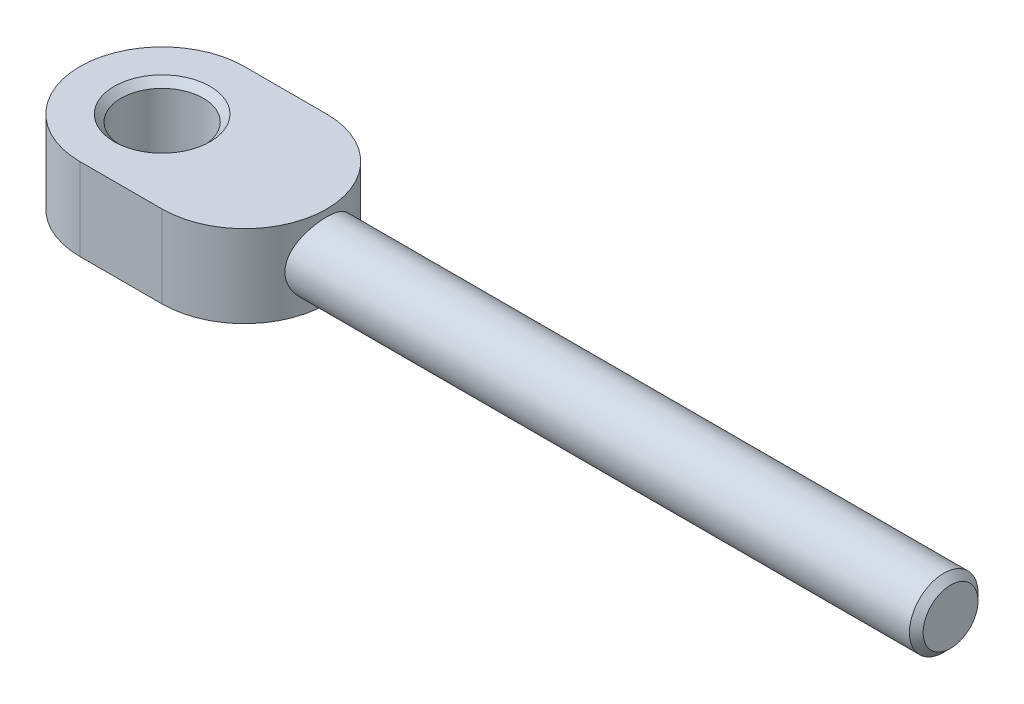
ISO-10303-21;
HEADER;
FILE_DESCRIPTION(('STEP AP214'),'2;1');
FILE_NAME('part.step','',(''),(''),'','','');
FILE_SCHEMA(('AUTOMOTIVE_DESIGN { 1 0 10303 214 1 1 1 1 }'));
ENDSEC;
DATA;
#1=APPLICATION_CONTEXT('core data for automotive mechanical design processes');
#2=APPLICATION_PROTOCOL_DEFINITION('international standard','automotive_design',2000,#1);
#3=PRODUCT_CONTEXT('',#1,'mechanical');
#4=PRODUCT('Part','Part','',(#3));
#5=PRODUCT_RELATED_PRODUCT_CATEGORY('part','',(#4));
#6=PRODUCT_DEFINITION_FORMATION('','',#4);
#7=PRODUCT_DEFINITION_CONTEXT('part definition',#1,'design');
#8=PRODUCT_DEFINITION('design','',#6,#7);
#9=PRODUCT_DEFINITION_SHAPE('','',#8);
#10=(LENGTH_UNIT() NAMED_UNIT(*) SI_UNIT(.MILLI.,.METRE.));
#11=(NAMED_UNIT(*) PLANE_ANGLE_UNIT() SI_UNIT($,.RADIAN.));
#12=(NAMED_UNIT(*) SI_UNIT($,.STERADIAN.) SOLID_ANGLE_UNIT());
#13=UNCERTAINTY_MEASURE_WITH_UNIT(LENGTH_MEASURE(1.E-05),#10,'distance_accuracy_value','');
#14=(GEOMETRIC_REPRESENTATION_CONTEXT(3) GLOBAL_UNCERTAINTY_ASSIGNED_CONTEXT((#13)) GLOBAL_UNIT_ASSIGNED_CONTEXT((#10,
#11,#12)) REPRESENTATION_CONTEXT('',''));
#15=CARTESIAN_POINT('',(0.,0.,0.));
#16=DIRECTION('',(0.,0.,1.));
#17=DIRECTION('',(1.,0.,0.));
#18=AXIS2_PLACEMENT_3D('',#15,#16,#17);
#19=CARTESIAN_POINT('',(115.000000000002,0.,-1.94289029309402E-13));
#20=DIRECTION('',(-1.00000000000002,0.,0.));
#21=DIRECTION('',(0.,0.,1.00000000000002));
#22=AXIS2_PLACEMENT_3D('',#19,#20,#21);
#23=CYLINDRICAL_SURFACE('',#22,5.);
#24=CARTESIAN_POINT('',(114.000000000002,0.,0.));
#25=DIRECTION('',(1.00000000000002,0.,0.));
#26=DIRECTION('',(0.,0.,-1.00000000000002));
#27=AXIS2_PLACEMENT_3D('',#24,#25,#26);
#28=CIRCLE('',#27,5.);
#29=CARTESIAN_POINT('',(114.000000000002,0.,-5.00000000000018));
#30=VERTEX_POINT('',#29);
#31=EDGE_CURVE('E11',#30,#30,#28,.F.);
#32=ORIENTED_EDGE('',*,*,#31,.T.);
#33=EDGE_LOOP('',(#32));
#34=FACE_BOUND('',#33,.T.);
#35=CARTESIAN_POINT('',(22.9087121146363,0.,4.99999999999988));
#36=CARTESIAN_POINT('',(22.9087130764541,0.133401342085642,4.99999907346949));
#37=CARTESIAN_POINT('',(22.9111675954635,0.266850090561973,4.99465346647838));
#38=CARTESIAN_POINT('',(22.9209052166454,0.532776879388233,4.97332510133892));
#39=CARTESIAN_POINT('',(22.9281914710264,0.665254228916836,4.95733539899088));
#40=CARTESIAN_POINT('',(22.9473646401102,0.928469473456003,4.91485001389278));
#41=CARTESIAN_POINT('',(22.9592613290628,1.05920305840854,4.88833200790232));
#42=CARTESIAN_POINT('',(22.9872633476554,1.31775831896715,4.82506361967674));
#43=CARTESIAN_POINT('',(23.0033704480098,1.44557874477889,4.78830893191542));
#44=CARTESIAN_POINT('',(23.0391992954804,1.69685363135249,4.70511611777522));
#45=CARTESIAN_POINT('',(23.0589043317805,1.82032525200758,4.65872262741848));
#46=CARTESIAN_POINT('',(23.1013893730746,2.06279425452701,4.55655723353386));
#47=CARTESIAN_POINT('',(23.1241705351678,2.18178993110429,4.50078179899437));
#48=CARTESIAN_POINT('',(23.1961478055548,2.53089882887935,4.32007909456542));
#49=CARTESIAN_POINT('',(23.2490254866256,2.7534507742884,4.1816696363317));
#50=CARTESIAN_POINT('',(23.3622340846154,3.18533767693499,3.863889601319));
#51=CARTESIAN_POINT('',(23.4228172047291,3.39321817234933,3.68264836841169));
#52=CARTESIAN_POINT('',(23.5425773354487,3.77681295725674,3.28805127368649));
#53=CARTESIAN_POINT('',(23.6017537962911,3.95251484459765,3.07468308711377));
#54=CARTESIAN_POINT('',(23.686117262969,4.19180337790088,2.72939811902856));
#55=CARTESIAN_POINT('',(23.714037011658,4.26885250368095,2.60726265021141));
#56=CARTESIAN_POINT('',(23.7670757792016,4.41231434720151,2.35633907958839));
#57=CARTESIAN_POINT('',(23.7921959593648,4.47873148029959,2.22755376893486));
#58=CARTESIAN_POINT('',(23.8389174407783,4.60033898521952,1.96416180919299));
#59=CARTESIAN_POINT('',(23.8605184059308,4.65552828486767,1.8295546056445));
#60=CARTESIAN_POINT('',(23.8995529267486,4.75409390371573,1.55556138641057));
#61=CARTESIAN_POINT('',(23.9169885604691,4.79747611490186,1.41617779348768));
#62=CARTESIAN_POINT('',(23.9463943774631,4.87004934123769,1.14097065626731));
#63=CARTESIAN_POINT('',(23.9586002649646,4.89985740691071,1.00533485679229));
#64=CARTESIAN_POINT('',(23.9784509152341,4.94810782465678,0.731783678022388));
#65=CARTESIAN_POINT('',(23.9860977087491,4.96655523720069,0.593869341826926));
#66=CARTESIAN_POINT('',(23.9966178230297,4.99189063921309,0.316820356986148));
#67=CARTESIAN_POINT('',(23.9994918028327,4.99878022460505,0.177685879487406));
#68=CARTESIAN_POINT('',(24.0003846753358,5.00092331936389,-0.100685666016704));
#69=CARTESIAN_POINT('',(23.9984037561418,4.99617727955981,-0.239922729838341));
#70=CARTESIAN_POINT('',(23.9899136606257,4.97575198143481,-0.508875497772758));
#71=CARTESIAN_POINT('',(23.9836886839465,4.96075876952393,-0.638652954685859));
#72=CARTESIAN_POINT('',(23.9671679484584,4.92071548412853,-0.896425733019643));
#73=CARTESIAN_POINT('',(23.9568708432385,4.89566208429525,-1.02442045048921));
#74=CARTESIAN_POINT('',(23.9324642419978,4.83574741321434,-1.27768058963465));
#75=CARTESIAN_POINT('',(23.9183560059373,4.80088938322167,-1.40294689855884));
#76=CARTESIAN_POINT('',(23.886674063129,4.72168676926434,-1.65000960949573));
#77=CARTESIAN_POINT('',(23.8690990384667,4.67733857702805,-1.77180467168411));
#78=CARTESIAN_POINT('',(23.8112061935106,4.52913174309925,-2.13440608091085));
#79=CARTESIAN_POINT('',(23.7660875760499,4.41097651707845,-2.36878813427721));
#80=CARTESIAN_POINT('',(23.6674248672801,4.14060259955268,-2.81488765750755));
#81=CARTESIAN_POINT('',(23.6138778002998,3.98837186961975,-3.0265970782525));
#82=CARTESIAN_POINT('',(23.4992708053812,3.64168484169971,-3.43734663974053));
#83=CARTESIAN_POINT('',(23.4379473626344,3.44500850419366,-3.63444183536825));
#84=CARTESIAN_POINT('',(23.3175068359432,3.02111055104933,-3.99374958281568));
#85=CARTESIAN_POINT('',(23.258390610643,2.79387720319629,-4.15594867394895));
#86=CARTESIAN_POINT('',(23.1754830102257,2.43023152890221,-4.37204843185939));
#87=CARTESIAN_POINT('',(23.148419949873,2.30295809039894,-4.44042007897777));
#88=CARTESIAN_POINT('',(23.0975376088837,2.04245647274751,-4.56609824374478));
#89=CARTESIAN_POINT('',(23.0737170007445,1.90923076039166,-4.62340929378724));
#90=CARTESIAN_POINT('',(23.0301558587158,1.63776732088177,-4.72639308965483));
#91=CARTESIAN_POINT('',(23.0104138355821,1.49953144487482,-4.77207008493308));
#92=CARTESIAN_POINT('',(22.9757324560175,1.21903964210898,-4.8513062064981));
#93=CARTESIAN_POINT('',(22.9607926721109,1.07678407439368,-4.88486641140469));
#94=CARTESIAN_POINT('',(22.937096979211,0.798757682076293,-4.93768074905161));
#95=CARTESIAN_POINT('',(22.9280027904064,0.663164820818757,-4.95772169190317));
#96=CARTESIAN_POINT('',(22.9148523191374,0.390552087598846,-4.98660737935067));
#97=CARTESIAN_POINT('',(22.9107956985945,0.253532312021159,-4.99545287528993));
#98=CARTESIAN_POINT('',(22.907869953007,-0.0207860598845476,-5.00183821697967));
#99=CARTESIAN_POINT('',(22.9089993303949,-0.158084564277709,-4.99938132653476));
#100=CARTESIAN_POINT('',(22.916399811976,-0.431871128286718,-4.98320111894265));
#101=CARTESIAN_POINT('',(22.922670762536,-0.568359211995655,-4.96947813843261));
#102=CARTESIAN_POINT('',(22.9395645956426,-0.830715742539823,-4.93217158492255));
#103=CARTESIAN_POINT('',(22.9498816230822,-0.956702590714348,-4.90927900797947));
#104=CARTESIAN_POINT('',(22.9744912995809,-1.20619548163048,-4.85401305684643));
#105=CARTESIAN_POINT('',(22.9887852266844,-1.32970071315868,-4.82163663468438));
#106=CARTESIAN_POINT('',(23.0370194337988,-1.69526799217255,-4.71071065616091));
#107=CARTESIAN_POINT('',(23.0763259662738,-1.93258045461715,-4.61833566351875));
#108=CARTESIAN_POINT('',(23.1668340116271,-2.39850178122618,-4.39509042810533));
#109=CARTESIAN_POINT('',(23.2184687772576,-2.6263164312283,-4.26275559713343));
#110=CARTESIAN_POINT('',(23.3271978594733,-3.05761567004123,-3.96481487774657));
#111=CARTESIAN_POINT('',(23.3842945333692,-3.26108966760645,-3.79919458936839));
#112=CARTESIAN_POINT('',(23.5031524298608,-3.65522822272604,-3.42333828888242));
#113=CARTESIAN_POINT('',(23.5649149877292,-3.84350149729717,-3.21056780271652));
#114=CARTESIAN_POINT('',(23.6525397242181,-4.09731296268247,-2.86918502481998));
#115=CARTESIAN_POINT('',(23.6809270167356,-4.17718980577939,-2.7516088248505));
#116=CARTESIAN_POINT('',(23.7352796462335,-4.32685243773145,-2.50969002115865));
#117=CARTESIAN_POINT('',(23.7612460253416,-4.39664257578391,-2.38535036573329));
#118=CARTESIAN_POINT('',(23.8101156015745,-4.52574998386247,-2.13027929692931));
#119=CARTESIAN_POINT('',(23.8330091330541,-4.58503438709471,-1.99952940315105));
#120=CARTESIAN_POINT('',(23.8749794540164,-4.69228865586859,-1.73293321082224));
#121=CARTESIAN_POINT('',(23.8940578848997,-4.74026338885414,-1.59708913398488));
#122=CARTESIAN_POINT('',(23.9278439649914,-4.82441160370132,-1.32129951277004));
#123=CARTESIAN_POINT('',(23.9425527871689,-4.86058825287263,-1.18135508018583));
#124=CARTESIAN_POINT('',(23.9671605398291,-4.92074045946561,-0.898454675987474));
#125=CARTESIAN_POINT('',(23.9770598307877,-4.9447169313007,-0.755498930910328));
#126=CARTESIAN_POINT('',(23.9912289923399,-4.97893515809701,-0.477883420739305));
#127=CARTESIAN_POINT('',(23.9958449399561,-4.99002214033322,-0.343344870081224));
#128=CARTESIAN_POINT('',(24.0005316025812,-5.00127843426219,-0.0736837007937017));
#129=CARTESIAN_POINT('',(24.000600790194,-5.00144407714272,0.061439098858615));
#130=CARTESIAN_POINT('',(23.9961887486256,-4.99084836103987,0.331106229534478));
#131=CARTESIAN_POINT('',(23.9917099776236,-4.98009290492887,0.465650833621884));
#132=CARTESIAN_POINT('',(23.9783256851577,-4.94777744445908,0.733261310715827));
#133=CARTESIAN_POINT('',(23.9694185152724,-4.92621341670747,0.866326614198201));
#134=CARTESIAN_POINT('',(23.9478093264381,-4.87346965622626,1.12521434278955));
#135=CARTESIAN_POINT('',(23.9352551439936,-4.84266322581637,1.25112522777286));
#136=CARTESIAN_POINT('',(23.9065633482736,-4.77150907395191,1.49981842973083));
#137=CARTESIAN_POINT('',(23.8904244841413,-4.73115802162892,1.62259963790773));
#138=CARTESIAN_POINT('',(23.8371898373545,-4.59630010949805,1.98503132832685));
#139=CARTESIAN_POINT('',(23.7952573948452,-4.48794487316257,2.21898154506235));
#140=CARTESIAN_POINT('',(23.7002297237166,-4.2320286177314,2.67613896894372));
#141=CARTESIAN_POINT('',(23.6467156543535,-4.08291706095642,2.89838282801017));
#142=CARTESIAN_POINT('',(23.5348651891758,-3.75198500696703,3.31565850042848));
#143=CARTESIAN_POINT('',(23.476527007517,-3.57015236713051,3.51068016389769));
#144=CARTESIAN_POINT('',(23.3565857314863,-3.16417617105097,3.8818248709547));
#145=CARTESIAN_POINT('',(23.2950305954801,-2.93799545156913,4.05575892113986));
#146=CARTESIAN_POINT('',(23.2086213285896,-2.57814226412518,4.28644220599592));
#147=CARTESIAN_POINT('',(23.1807840573517,-2.45464555962548,4.35834922317815));
#148=CARTESIAN_POINT('',(23.1279493027588,-2.20148847551084,4.49153302890012));
#149=CARTESIAN_POINT('',(23.1029505274215,-2.07183093851672,4.55281466048565));
#150=CARTESIAN_POINT('',(23.0567342904302,-1.80781229372493,4.66392927630343));
#151=CARTESIAN_POINT('',(23.0354990935147,-1.67347702103789,4.71381629567));
#152=CARTESIAN_POINT('',(22.9974167298329,-1.4005073130341,4.80199267289366));
#153=CARTESIAN_POINT('',(22.9805674126512,-1.26187502201883,4.84028771585223));
#154=CARTESIAN_POINT('',(22.9519122752479,-0.981708136079763,4.90477948429197));
#155=CARTESIAN_POINT('',(22.9400931451405,-0.840182252039889,4.9310081525188));
#156=CARTESIAN_POINT('',(22.9219030893159,-0.555123946379709,4.97116941842814));
#157=CARTESIAN_POINT('',(22.9155279262965,-0.411593173868511,4.98511157956281));
#158=CARTESIAN_POINT('',(22.910902848785,-0.223148156125496,4.99521783051908));
#159=CARTESIAN_POINT('',(22.9100818615665,-0.178543241685151,4.99701063605617));
#160=CARTESIAN_POINT('',(22.9089863310184,-0.0892939886391438,4.99940188134434));
#161=CARTESIAN_POINT('',(22.9087117927143,-0.0446496496746846,5.00000031011113));
#162=CARTESIAN_POINT('',(22.9087121146363,0.,4.99999999999988));
#163=B_SPLINE_CURVE_WITH_KNOTS('',3,(#35,#36,#37,#38,#39,#40,#41,#42,#43,#44,#45,#46,#47,#48,
#49,#50,#51,#52,#53,#54,#55,#56,#57,#58,#59,#60,#61,#62,#63,#64,#65,#66,#67,#68,#69,#70,#71,#72,
#73,#74,#75,#76,#77,#78,#79,#80,#81,#82,#83,#84,#85,#86,#87,#88,#89,#90,#91,#92,#93,#94,#95,#96,
#97,#98,#99,#100,#101,#102,#103,#104,#105,#106,#107,#108,#109,#110,#111,#112,#113,#114,#115,
#116,#117,#118,#119,#120,#121,#122,#123,#124,#125,#126,#127,#128,#129,#130,#131,#132,#133,#134,
#135,#136,#137,#138,#139,#140,#141,#142,#143,#144,#145,#146,#147,#148,#149,#150,#151,#152,#153,
#154,#155,#156,#157,#158,#159,#160,#161,#162),.UNSPECIFIED.,.T.,.F.,(4,2,2,2,2,2,2,2,2,2,2,2,2,
2,2,2,2,2,2,2,2,2,2,2,2,2,2,2,2,2,2,2,2,2,2,2,2,2,2,2,2,2,2,2,2,2,2,2,2,2,2,2,2,2,2,2,2,2,2,2,2,
2,2,4),(0.,0.400157436000185,0.800576190593221,1.201848529411,1.60328989804516,2.0029121038093,
2.4026850502781,3.20123019587007,4.04483609889584,4.88876646006611,5.32954710296573,
5.77014421661478,6.21078338424769,6.65120225878058,7.06888225409976,7.48637606389433,
7.90381222072142,8.32123220399826,8.71313663078891,9.10517074557808,9.49707541213128,
9.88912935105435,10.6843842085816,11.4799204638783,12.3315328967584,13.1834732406337,
13.6239634696044,14.064272810136,14.5044210919574,14.9445301827247,15.3560893757574,
15.7676209469674,16.1790336871391,16.5904341345126,16.9753736617613,17.3604370390525,
18.129966872946,18.9320860691316,19.7345530282235,20.6023475058254,21.0367677320599,
21.4710000820442,21.9065678086379,22.3419477324183,22.7772106778489,23.2124409951532,
23.6171514188592,24.0219977964935,24.4266254703976,24.8314038752674,25.2216396203095,
25.6120117507035,26.3921129345309,27.2074696624054,28.0231295912001,28.8942922255874,
29.3306260081946,29.7667603842385,30.2007814897644,30.6345893903395,31.067242188193,
31.4995579237517,31.6334900472164,31.7674234024045),.UNSPECIFIED.);
#164=CARTESIAN_POINT('',(22.9087121146363,0.,4.99999999999988));
#165=VERTEX_POINT('',#164);
#166=EDGE_CURVE('E132',#165,#165,#163,.T.);
#167=ORIENTED_EDGE('',*,*,#166,.F.);
#168=EDGE_LOOP('',(#167));
#169=FACE_BOUND('',#168,.T.);
#170=ADVANCED_FACE('F41',(#34,#169),#23,.T.);
#171=CARTESIAN_POINT('',(115.000000000002,0.,-1.94289029309402E-13));
#172=DIRECTION('',(1.00000000000002,0.,0.));
#173=DIRECTION('',(0.,0.,-1.00000000000002));
#174=AXIS2_PLACEMENT_3D('',#171,#172,#173);
#175=PLANE('',#174);
#176=CARTESIAN_POINT('',(115.000000000002,0.,-1.94289029309402E-13));
#177=DIRECTION('',(1.00000000000002,0.,0.));
#178=DIRECTION('',(0.,0.,-1.00000000000002));
#179=AXIS2_PLACEMENT_3D('',#176,#177,#178);
#180=CIRCLE('',#179,3.99999999999999);
#181=CARTESIAN_POINT('',(115.000000000002,0.,-4.00000000000026));
#182=VERTEX_POINT('',#181);
#183=EDGE_CURVE('E52',#182,#182,#180,.T.);
#184=ORIENTED_EDGE('',*,*,#183,.T.);
#185=EDGE_LOOP('',(#184));
#186=FACE_BOUND('',#185,.T.);
#187=ADVANCED_FACE('F151',(#186),#175,.T.);
#188=CARTESIAN_POINT('',(12.0000000000002,6.00000000000001,-1.59594559789866E-13));
#189=DIRECTION('',(0.,-1.,0.));
#190=DIRECTION('',(0.,0.,-1.00000000000002));
#191=AXIS2_PLACEMENT_3D('',#188,#189,#190);
#192=CYLINDRICAL_SURFACE('',#191,12.);
#193=CARTESIAN_POINT('',(12.0000000000005,-6.00000000000001,-1.2490009027033E-13));
#194=DIRECTION('',(0.,1.,0.));
#195=DIRECTION('',(0.,0.,1.00000000000002));
#196=AXIS2_PLACEMENT_3D('',#193,#194,#195);
#197=CIRCLE('',#196,12.);
#198=CARTESIAN_POINT('',(12.0000000000002,-6.00000000000001,12.));
#199=VERTEX_POINT('',#198);
#200=CARTESIAN_POINT('',(12.0000000000005,-6.00000000000001,-12.0000000000003));
#201=VERTEX_POINT('',#200);
#202=EDGE_CURVE('E77',#199,#201,#197,.T.);
#203=ORIENTED_EDGE('',*,*,#202,.T.);
#204=DIRECTION('',(0.,-1.,0.));
#205=VECTOR('',#204,1.);
#206=CARTESIAN_POINT('',(12.0000000000003,6.00000000000001,-12.0000000000005));
#207=LINE('',#206,#205);
#208=CARTESIAN_POINT('',(12.0000000000003,6.00000000000001,-12.0000000000005));
#209=VERTEX_POINT('',#208);
#210=EDGE_CURVE('E105',#209,#201,#207,.T.);
#211=ORIENTED_EDGE('',*,*,#210,.F.);
#212=CARTESIAN_POINT('',(12.0000000000002,6.00000000000001,-1.59594559789866E-13));
#213=DIRECTION('',(0.,1.,0.));
#214=DIRECTION('',(0.,0.,1.00000000000002));
#215=AXIS2_PLACEMENT_3D('',#212,#213,#214);
#216=CIRCLE('',#215,12.);
#217=CARTESIAN_POINT('',(12.0000000000001,6.00000000000001,12.));
#218=VERTEX_POINT('',#217);
#219=EDGE_CURVE('E94',#218,#209,#216,.T.);
#220=ORIENTED_EDGE('',*,*,#219,.F.);
#221=DIRECTION('',(0.,-1.,0.));
#222=VECTOR('',#221,1.);
#223=CARTESIAN_POINT('',(12.0000000000001,6.00000000000001,12.));
#224=LINE('',#223,#222);
#225=EDGE_CURVE('E100',#218,#199,#224,.T.);
#226=ORIENTED_EDGE('',*,*,#225,.T.);
#227=EDGE_LOOP('',(#203,#211,#220,#226));
#228=FACE_BOUND('',#227,.T.);
#229=ORIENTED_EDGE('',*,*,#166,.T.);
#230=EDGE_LOOP('',(#229));
#231=FACE_BOUND('',#230,.T.);
#232=ADVANCED_FACE('F107',(#228,#231),#192,.T.);
#233=CARTESIAN_POINT('',(0.,6.00000000000001,0.));
#234=DIRECTION('',(0.,-1.,0.));
#235=DIRECTION('',(0.,0.,-1.00000000000002));
#236=AXIS2_PLACEMENT_3D('',#233,#234,#235);
#237=CYLINDRICAL_SURFACE('',#236,12.);
#238=CARTESIAN_POINT('',(0.,-6.00000000000001,0.));
#239=DIRECTION('',(0.,1.,0.));
#240=DIRECTION('',(0.,0.,1.00000000000002));
#241=AXIS2_PLACEMENT_3D('',#238,#239,#240);
#242=CIRCLE('',#241,12.);
#243=CARTESIAN_POINT('',(0.,-6.00000000000001,-12.0000000000001));
#244=VERTEX_POINT('',#243);
#245=CARTESIAN_POINT('',(0.,-6.00000000000001,12.));
#246=VERTEX_POINT('',#245);
#247=EDGE_CURVE('E116',#244,#246,#242,.T.);
#248=ORIENTED_EDGE('',*,*,#247,.T.);
#249=DIRECTION('',(0.,-1.,0.));
#250=VECTOR('',#249,1.);
#251=CARTESIAN_POINT('',(0.,6.00000000000001,12.));
#252=LINE('',#251,#250);
#253=CARTESIAN_POINT('',(0.,6.00000000000001,12.));
#254=VERTEX_POINT('',#253);
#255=EDGE_CURVE('E104',#254,#246,#252,.T.);
#256=ORIENTED_EDGE('',*,*,#255,.F.);
#257=CARTESIAN_POINT('',(0.,6.00000000000001,0.));
#258=DIRECTION('',(0.,1.,0.));
#259=DIRECTION('',(0.,0.,1.00000000000002));
#260=AXIS2_PLACEMENT_3D('',#257,#258,#259);
#261=CIRCLE('',#260,12.);
#262=CARTESIAN_POINT('',(0.,6.00000000000001,-12.0000000000003));
#263=VERTEX_POINT('',#262);
#264=EDGE_CURVE('E96',#263,#254,#261,.T.);
#265=ORIENTED_EDGE('',*,*,#264,.F.);
#266=DIRECTION('',(0.,-1.,0.));
#267=VECTOR('',#266,1.);
#268=CARTESIAN_POINT('',(0.,6.00000000000001,-12.0000000000003));
#269=LINE('',#268,#267);
#270=EDGE_CURVE('E112',#263,#244,#269,.T.);
#271=ORIENTED_EDGE('',*,*,#270,.T.);
#272=EDGE_LOOP('',(#248,#256,#265,#271));
#273=FACE_BOUND('',#272,.T.);
#274=ADVANCED_FACE('F150',(#273),#237,.T.);
#275=CARTESIAN_POINT('',(0.,6.00000000000001,12.));
#276=DIRECTION('',(0.,0.,-1.00000000000002));
#277=DIRECTION('',(-1.00000000000002,0.,0.));
#278=AXIS2_PLACEMENT_3D('',#275,#276,#277);
#279=PLANE('',#278);
#280=DIRECTION('',(1.00000000000002,0.,0.));
#281=VECTOR('',#280,1.);
#282=CARTESIAN_POINT('',(0.,-6.00000000000001,12.));
#283=LINE('',#282,#281);
#284=EDGE_CURVE('E102',#246,#199,#283,.T.);
#285=ORIENTED_EDGE('',*,*,#284,.T.);
#286=ORIENTED_EDGE('',*,*,#225,.F.);
#287=DIRECTION('',(1.00000000000002,0.,0.));
#288=VECTOR('',#287,1.);
#289=CARTESIAN_POINT('',(0.,6.00000000000001,12.));
#290=LINE('',#289,#288);
#291=EDGE_CURVE('E91',#254,#218,#290,.T.);
#292=ORIENTED_EDGE('',*,*,#291,.F.);
#293=ORIENTED_EDGE('',*,*,#255,.T.);
#294=EDGE_LOOP('',(#285,#286,#292,#293));
#295=FACE_BOUND('',#294,.T.);
#296=ADVANCED_FACE('F101',(#295),#279,.F.);
#297=CARTESIAN_POINT('',(0.,6.00000000000001,-12.0000000000003));
#298=DIRECTION('',(0.,0.,1.00000000000002));
#299=DIRECTION('',(1.00000000000002,0.,0.));
#300=AXIS2_PLACEMENT_3D('',#297,#298,#299);
#301=PLANE('',#300);
#302=DIRECTION('',(-1.00000000000002,0.,0.));
#303=VECTOR('',#302,1.);
#304=CARTESIAN_POINT('',(0.,-6.00000000000001,-12.0000000000001));
#305=LINE('',#304,#303);
#306=EDGE_CURVE('E83',#201,#244,#305,.T.);
#307=ORIENTED_EDGE('',*,*,#306,.T.);
#308=ORIENTED_EDGE('',*,*,#270,.F.);
#309=DIRECTION('',(-1.00000000000002,0.,0.));
#310=VECTOR('',#309,1.);
#311=CARTESIAN_POINT('',(0.,6.00000000000001,-12.0000000000003));
#312=LINE('',#311,#310);
#313=EDGE_CURVE('E60',#209,#263,#312,.T.);
#314=ORIENTED_EDGE('',*,*,#313,.F.);
#315=ORIENTED_EDGE('',*,*,#210,.T.);
#316=EDGE_LOOP('',(#307,#308,#314,#315));
#317=FACE_BOUND('',#316,.T.);
#318=ADVANCED_FACE('F152',(#317),#301,.F.);
#319=CARTESIAN_POINT('',(0.,6.00000000000001,0.));
#320=DIRECTION('',(0.,1.,0.));
#321=DIRECTION('',(0.,0.,1.00000000000002));
#322=AXIS2_PLACEMENT_3D('',#319,#320,#321);
#323=PLANE('',#322);
#324=CARTESIAN_POINT('',(0.,6.00000000000001,0.));
#325=DIRECTION('',(0.,1.,0.));
#326=DIRECTION('',(0.,0.,1.00000000000002));
#327=AXIS2_PLACEMENT_3D('',#324,#325,#326);
#328=CIRCLE('',#327,7.00000000000005);
#329=CARTESIAN_POINT('',(0.,6.00000000000001,7.00000000000018));
#330=VERTEX_POINT('',#329);
#331=EDGE_CURVE('E168',#330,#330,#328,.F.);
#332=ORIENTED_EDGE('',*,*,#331,.T.);
#333=EDGE_LOOP('',(#332));
#334=FACE_BOUND('',#333,.T.);
#335=ORIENTED_EDGE('',*,*,#264,.T.);
#336=ORIENTED_EDGE('',*,*,#291,.T.);
#337=ORIENTED_EDGE('',*,*,#219,.T.);
#338=ORIENTED_EDGE('',*,*,#313,.T.);
#339=EDGE_LOOP('',(#335,#336,#337,#338));
#340=FACE_BOUND('',#339,.T.);
#341=ADVANCED_FACE('F92',(#334,#340),#323,.T.);
#342=CARTESIAN_POINT('',(0.,-6.00000000000001,0.));
#343=DIRECTION('',(0.,1.,0.));
#344=DIRECTION('',(0.,0.,1.00000000000002));
#345=AXIS2_PLACEMENT_3D('',#342,#343,#344);
#346=PLANE('',#345);
#347=CARTESIAN_POINT('',(0.,-6.00000000000001,0.));
#348=DIRECTION('',(0.,1.,0.));
#349=DIRECTION('',(0.,0.,1.00000000000002));
#350=AXIS2_PLACEMENT_3D('',#347,#348,#349);
#351=CIRCLE('',#350,7.00000000000002);
#352=CARTESIAN_POINT('',(0.,-6.00000000000001,7.00000000000014));
#353=VERTEX_POINT('',#352);
#354=EDGE_CURVE('E171',#353,#353,#351,.T.);
#355=ORIENTED_EDGE('',*,*,#354,.T.);
#356=EDGE_LOOP('',(#355));
#357=FACE_BOUND('',#356,.T.);
#358=ORIENTED_EDGE('',*,*,#247,.F.);
#359=ORIENTED_EDGE('',*,*,#306,.F.);
#360=ORIENTED_EDGE('',*,*,#202,.F.);
#361=ORIENTED_EDGE('',*,*,#284,.F.);
#362=EDGE_LOOP('',(#358,#359,#360,#361));
#363=FACE_BOUND('',#362,.T.);
#364=ADVANCED_FACE('F208',(#357,#363),#346,.F.);
#365=CARTESIAN_POINT('',(0.,-6.00099999999998,0.));
#366=DIRECTION('',(0.,1.,0.));
#367=DIRECTION('',(0.,0.,1.00000000000002));
#368=AXIS2_PLACEMENT_3D('',#365,#366,#367);
#369=CYLINDRICAL_SURFACE('',#368,6.);
#370=CARTESIAN_POINT('',(0.,-5.,0.));
#371=DIRECTION('',(0.,1.,0.));
#372=DIRECTION('',(0.,0.,1.00000000000002));
#373=AXIS2_PLACEMENT_3D('',#370,#371,#372);
#374=CIRCLE('',#373,6.);
#375=CARTESIAN_POINT('',(0.,-5.,6.00000000000008));
#376=VERTEX_POINT('',#375);
#377=EDGE_CURVE('E176',#376,#376,#374,.F.);
#378=ORIENTED_EDGE('',*,*,#377,.T.);
#379=EDGE_LOOP('',(#378));
#380=FACE_BOUND('',#379,.T.);
#381=CARTESIAN_POINT('',(0.,4.99999999999995,0.));
#382=DIRECTION('',(0.,1.,0.));
#383=DIRECTION('',(0.,0.,1.00000000000002));
#384=AXIS2_PLACEMENT_3D('',#381,#382,#383);
#385=CIRCLE('',#384,6.);
#386=CARTESIAN_POINT('',(0.,4.99999999999995,6.00000000000011));
#387=VERTEX_POINT('',#386);
#388=EDGE_CURVE('E141',#387,#387,#385,.T.);
#389=ORIENTED_EDGE('',*,*,#388,.T.);
#390=EDGE_LOOP('',(#389));
#391=FACE_BOUND('',#390,.T.);
#392=ADVANCED_FACE('F185',(#380,#391),#369,.F.);
#393=CARTESIAN_POINT('',(0.,-5.,0.));
#394=DIRECTION('',(0.,-1.,0.));
#395=DIRECTION('',(0.,0.,-1.00000000000002));
#396=AXIS2_PLACEMENT_3D('',#393,#394,#395);
#397=CONICAL_SURFACE('',#396,6.,0.785398163397459);
#398=ORIENTED_EDGE('',*,*,#354,.F.);
#399=EDGE_LOOP('',(#398));
#400=FACE_BOUND('',#399,.T.);
#401=ORIENTED_EDGE('',*,*,#377,.F.);
#402=EDGE_LOOP('',(#401));
#403=FACE_BOUND('',#402,.T.);
#404=ADVANCED_FACE('F189',(#400,#403),#397,.F.);
#405=CARTESIAN_POINT('',(0.,4.99999999999995,0.));
#406=DIRECTION('',(0.,1.,0.));
#407=DIRECTION('',(0.,0.,1.00000000000002));
#408=AXIS2_PLACEMENT_3D('',#405,#406,#407);
#409=CONICAL_SURFACE('',#408,6.,0.785398163397452);
#410=ORIENTED_EDGE('',*,*,#331,.F.);
#411=EDGE_LOOP('',(#410));
#412=FACE_BOUND('',#411,.T.);
#413=ORIENTED_EDGE('',*,*,#388,.F.);
#414=EDGE_LOOP('',(#413));
#415=FACE_BOUND('',#414,.T.);
#416=ADVANCED_FACE('F187',(#412,#415),#409,.F.);
#417=CARTESIAN_POINT('',(115.000000000002,0.,-1.94289029309402E-13));
#418=DIRECTION('',(-1.00000000000002,0.,0.));
#419=DIRECTION('',(0.,0.,1.00000000000002));
#420=AXIS2_PLACEMENT_3D('',#417,#418,#419);
#421=CONICAL_SURFACE('',#420,3.99999999999999,0.785398163397446);
#422=ORIENTED_EDGE('',*,*,#31,.F.);
#423=EDGE_LOOP('',(#422));
#424=FACE_BOUND('',#423,.T.);
#425=ORIENTED_EDGE('',*,*,#183,.F.);
#426=EDGE_LOOP('',(#425));
#427=FACE_BOUND('',#426,.T.);
#428=ADVANCED_FACE('F44',(#424,#427),#421,.T.);
#429=CLOSED_SHELL('',(#170,#187,#232,#274,#296,#318,#341,#364,#392,#404,#416,#428));
#430=MANIFOLD_SOLID_BREP('B2',#429);
#431=ADVANCED_BREP_SHAPE_REPRESENTATION('',(#18,#430),#14);
#432=SHAPE_DEFINITION_REPRESENTATION(#9,#431);
ENDSEC;
END-ISO-10303-21;
